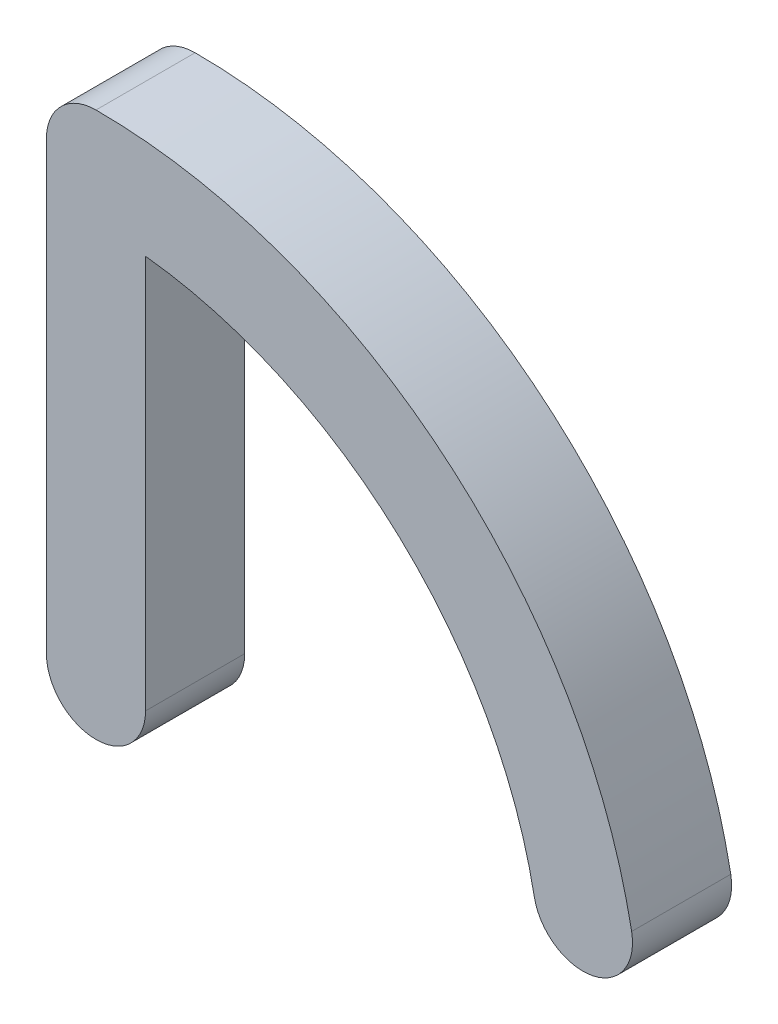
ISO-10303-21;
HEADER;
FILE_DESCRIPTION(('STEP AP214'),'2;1');
FILE_NAME('part.step','',(''),(''),'','','');
FILE_SCHEMA(('AUTOMOTIVE_DESIGN { 1 0 10303 214 1 1 1 1 }'));
ENDSEC;
DATA;
#1=APPLICATION_CONTEXT('core data for automotive mechanical design processes');
#2=APPLICATION_PROTOCOL_DEFINITION('international standard','automotive_design',2000,#1);
#3=PRODUCT_CONTEXT('',#1,'mechanical');
#4=PRODUCT('Part','Part','',(#3));
#5=PRODUCT_RELATED_PRODUCT_CATEGORY('part','',(#4));
#6=PRODUCT_DEFINITION_FORMATION('','',#4);
#7=PRODUCT_DEFINITION_CONTEXT('part definition',#1,'design');
#8=PRODUCT_DEFINITION('design','',#6,#7);
#9=PRODUCT_DEFINITION_SHAPE('','',#8);
#10=(LENGTH_UNIT() NAMED_UNIT(*) SI_UNIT(.MILLI.,.METRE.));
#11=(NAMED_UNIT(*) PLANE_ANGLE_UNIT() SI_UNIT($,.RADIAN.));
#12=(NAMED_UNIT(*) SI_UNIT($,.STERADIAN.) SOLID_ANGLE_UNIT());
#13=UNCERTAINTY_MEASURE_WITH_UNIT(LENGTH_MEASURE(1.E-05),#10,'distance_accuracy_value','');
#14=(GEOMETRIC_REPRESENTATION_CONTEXT(3) GLOBAL_UNCERTAINTY_ASSIGNED_CONTEXT((#13)) GLOBAL_UNIT_ASSIGNED_CONTEXT((#10,
#11,#12)) REPRESENTATION_CONTEXT('',''));
#15=CARTESIAN_POINT('',(0.,0.,0.));
#16=DIRECTION('',(0.,0.,1.));
#17=DIRECTION('',(1.,0.,0.));
#18=AXIS2_PLACEMENT_3D('',#15,#16,#17);
#19=CARTESIAN_POINT('',(0.,0.,10.));
#20=DIRECTION('',(0.,0.,-1.));
#21=DIRECTION('',(-1.,0.,0.));
#22=AXIS2_PLACEMENT_3D('',#19,#20,#21);
#23=CYLINDRICAL_SURFACE('',#22,45.);
#24=CARTESIAN_POINT('',(0.,0.,0.));
#25=DIRECTION('',(0.,0.,1.));
#26=DIRECTION('',(1.,0.,0.));
#27=AXIS2_PLACEMENT_3D('',#24,#25,#26);
#28=CIRCLE('',#27,45.);
#29=CARTESIAN_POINT('',(5.,44.7213595499958,0.));
#30=VERTEX_POINT('',#29);
#31=CARTESIAN_POINT('',(44.2118535857435,8.38522525116545,0.));
#32=VERTEX_POINT('',#31);
#33=EDGE_CURVE('E179',#30,#32,#28,.F.);
#34=ORIENTED_EDGE('',*,*,#33,.T.);
#35=DIRECTION('',(0.,0.,-1.));
#36=VECTOR('',#35,1.);
#37=CARTESIAN_POINT('',(44.2118535857435,8.38522525116545,10.));
#38=LINE('',#37,#36);
#39=CARTESIAN_POINT('',(44.2118535857435,8.38522525116545,10.));
#40=VERTEX_POINT('',#39);
#41=EDGE_CURVE('E248',#32,#40,#38,.F.);
#42=ORIENTED_EDGE('',*,*,#41,.T.);
#43=CARTESIAN_POINT('',(0.,0.,10.));
#44=DIRECTION('',(0.,0.,1.));
#45=DIRECTION('',(1.,0.,0.));
#46=AXIS2_PLACEMENT_3D('',#43,#44,#45);
#47=CIRCLE('',#46,45.);
#48=CARTESIAN_POINT('',(5.,44.7213595499958,10.));
#49=VERTEX_POINT('',#48);
#50=EDGE_CURVE('E185',#49,#40,#47,.F.);
#51=ORIENTED_EDGE('',*,*,#50,.F.);
#52=DIRECTION('',(0.,0.,-1.));
#53=VECTOR('',#52,1.);
#54=CARTESIAN_POINT('',(5.,44.7213595499958,10.));
#55=LINE('',#54,#53);
#56=EDGE_CURVE('E200',#49,#30,#55,.T.);
#57=ORIENTED_EDGE('',*,*,#56,.T.);
#58=EDGE_LOOP('',(#34,#42,#51,#57));
#59=FACE_BOUND('',#58,.T.);
#60=ADVANCED_FACE('F39',(#59),#23,.F.);
#61=CARTESIAN_POINT('',(0.,0.,10.));
#62=DIRECTION('',(0.,0.,-1.));
#63=DIRECTION('',(-1.,0.,0.));
#64=AXIS2_PLACEMENT_3D('',#61,#62,#63);
#65=CYLINDRICAL_SURFACE('',#64,55.);
#66=CARTESIAN_POINT('',(0.,0.,10.));
#67=DIRECTION('',(0.,0.,1.));
#68=DIRECTION('',(1.,0.,0.));
#69=AXIS2_PLACEMENT_3D('',#66,#67,#68);
#70=CIRCLE('',#69,55.);
#71=CARTESIAN_POINT('',(0.,55.,10.));
#72=VERTEX_POINT('',#71);
#73=CARTESIAN_POINT('',(54.0367099381309,10.2486086403133,10.));
#74=VERTEX_POINT('',#73);
#75=EDGE_CURVE('E189',#72,#74,#70,.F.);
#76=ORIENTED_EDGE('',*,*,#75,.T.);
#77=DIRECTION('',(0.,0.,-1.));
#78=VECTOR('',#77,1.);
#79=CARTESIAN_POINT('',(54.0367099381309,10.2486086403133,10.));
#80=LINE('',#79,#78);
#81=CARTESIAN_POINT('',(54.0367099381309,10.2486086403133,0.));
#82=VERTEX_POINT('',#81);
#83=EDGE_CURVE('E230',#74,#82,#80,.T.);
#84=ORIENTED_EDGE('',*,*,#83,.T.);
#85=CARTESIAN_POINT('',(0.,0.,0.));
#86=DIRECTION('',(0.,0.,1.));
#87=DIRECTION('',(1.,0.,0.));
#88=AXIS2_PLACEMENT_3D('',#85,#86,#87);
#89=CIRCLE('',#88,55.);
#90=CARTESIAN_POINT('',(0.,55.,0.));
#91=VERTEX_POINT('',#90);
#92=EDGE_CURVE('E204',#91,#82,#89,.F.);
#93=ORIENTED_EDGE('',*,*,#92,.F.);
#94=DIRECTION('',(0.,0.,-1.));
#95=VECTOR('',#94,1.);
#96=CARTESIAN_POINT('',(0.,55.,10.));
#97=LINE('',#96,#95);
#98=EDGE_CURVE('E223',#91,#72,#97,.F.);
#99=ORIENTED_EDGE('',*,*,#98,.T.);
#100=EDGE_LOOP('',(#76,#84,#93,#99));
#101=FACE_BOUND('',#100,.T.);
#102=ADVANCED_FACE('F306',(#101),#65,.T.);
#103=CARTESIAN_POINT('',(-5.,0.,10.));
#104=DIRECTION('',(-1.,0.,0.));
#105=DIRECTION('',(0.,0.,1.));
#106=AXIS2_PLACEMENT_3D('',#103,#104,#105);
#107=PLANE('',#106);
#108=DIRECTION('',(0.,1.,0.));
#109=VECTOR('',#108,1.);
#110=CARTESIAN_POINT('',(-5.,0.,0.));
#111=LINE('',#110,#109);
#112=CARTESIAN_POINT('',(-5.,5.,0.));
#113=VERTEX_POINT('',#112);
#114=CARTESIAN_POINT('',(-5.,50.,0.));
#115=VERTEX_POINT('',#114);
#116=EDGE_CURVE('E208',#113,#115,#111,.T.);
#117=ORIENTED_EDGE('',*,*,#116,.F.);
#118=DIRECTION('',(0.,0.,-1.));
#119=VECTOR('',#118,1.);
#120=CARTESIAN_POINT('',(-5.,5.,10.));
#121=LINE('',#120,#119);
#122=CARTESIAN_POINT('',(-5.,5.,10.));
#123=VERTEX_POINT('',#122);
#124=EDGE_CURVE('E48',#113,#123,#121,.F.);
#125=ORIENTED_EDGE('',*,*,#124,.T.);
#126=DIRECTION('',(0.,1.,0.));
#127=VECTOR('',#126,1.);
#128=CARTESIAN_POINT('',(-5.,0.,10.));
#129=LINE('',#128,#127);
#130=CARTESIAN_POINT('',(-5.,50.,10.));
#131=VERTEX_POINT('',#130);
#132=EDGE_CURVE('E194',#123,#131,#129,.T.);
#133=ORIENTED_EDGE('',*,*,#132,.T.);
#134=DIRECTION('',(0.,0.,-1.));
#135=VECTOR('',#134,1.);
#136=CARTESIAN_POINT('',(-5.,50.,10.));
#137=LINE('',#136,#135);
#138=EDGE_CURVE('E216',#131,#115,#137,.T.);
#139=ORIENTED_EDGE('',*,*,#138,.T.);
#140=EDGE_LOOP('',(#117,#125,#133,#139));
#141=FACE_BOUND('',#140,.T.);
#142=ADVANCED_FACE('F278',(#141),#107,.T.);
#143=CARTESIAN_POINT('',(5.,0.,10.));
#144=DIRECTION('',(-1.,0.,0.));
#145=DIRECTION('',(0.,0.,1.));
#146=AXIS2_PLACEMENT_3D('',#143,#144,#145);
#147=PLANE('',#146);
#148=DIRECTION('',(0.,1.,0.));
#149=VECTOR('',#148,1.);
#150=CARTESIAN_POINT('',(5.,0.,10.));
#151=LINE('',#150,#149);
#152=CARTESIAN_POINT('',(5.,5.,10.));
#153=VERTEX_POINT('',#152);
#154=EDGE_CURVE('E197',#153,#49,#151,.T.);
#155=ORIENTED_EDGE('',*,*,#154,.F.);
#156=DIRECTION('',(0.,0.,-1.));
#157=VECTOR('',#156,1.);
#158=CARTESIAN_POINT('',(5.,5.,0.));
#159=LINE('',#158,#157);
#160=CARTESIAN_POINT('',(5.,5.,0.));
#161=VERTEX_POINT('',#160);
#162=EDGE_CURVE('E254',#153,#161,#159,.T.);
#163=ORIENTED_EDGE('',*,*,#162,.T.);
#164=DIRECTION('',(0.,1.,0.));
#165=VECTOR('',#164,1.);
#166=CARTESIAN_POINT('',(5.,0.,0.));
#167=LINE('',#166,#165);
#168=EDGE_CURVE('E190',#161,#30,#167,.T.);
#169=ORIENTED_EDGE('',*,*,#168,.T.);
#170=ORIENTED_EDGE('',*,*,#56,.F.);
#171=EDGE_LOOP('',(#155,#163,#169,#170));
#172=FACE_BOUND('',#171,.T.);
#173=ADVANCED_FACE('F289',(#172),#147,.F.);
#174=CARTESIAN_POINT('',(0.,0.,10.));
#175=DIRECTION('',(0.,0.,1.));
#176=DIRECTION('',(1.,0.,0.));
#177=AXIS2_PLACEMENT_3D('',#174,#175,#176);
#178=PLANE('',#177);
#179=ORIENTED_EDGE('',*,*,#132,.F.);
#180=CARTESIAN_POINT('',(0.,5.,10.));
#181=DIRECTION('',(0.,0.,1.));
#182=DIRECTION('',(1.,0.,0.));
#183=AXIS2_PLACEMENT_3D('',#180,#181,#182);
#184=CIRCLE('',#183,5.);
#185=CARTESIAN_POINT('',(0.,0.,10.));
#186=VERTEX_POINT('',#185);
#187=EDGE_CURVE('E11',#123,#186,#184,.T.);
#188=ORIENTED_EDGE('',*,*,#187,.T.);
#189=CARTESIAN_POINT('',(0.,5.,10.));
#190=DIRECTION('',(0.,0.,1.));
#191=DIRECTION('',(1.,0.,0.));
#192=AXIS2_PLACEMENT_3D('',#189,#190,#191);
#193=CIRCLE('',#192,5.);
#194=EDGE_CURVE('E266',#186,#153,#193,.T.);
#195=ORIENTED_EDGE('',*,*,#194,.T.);
#196=ORIENTED_EDGE('',*,*,#154,.T.);
#197=ORIENTED_EDGE('',*,*,#50,.T.);
#198=CARTESIAN_POINT('',(49.1242817619372,9.31691694573939,10.));
#199=DIRECTION('',(0.,0.,1.));
#200=DIRECTION('',(1.,0.,0.));
#201=AXIS2_PLACEMENT_3D('',#198,#199,#200);
#202=CIRCLE('',#201,5.);
#203=CARTESIAN_POINT('',(49.5600604756755,4.33594345528066,10.));
#204=VERTEX_POINT('',#203);
#205=EDGE_CURVE('E251',#40,#204,#202,.T.);
#206=ORIENTED_EDGE('',*,*,#205,.T.);
#207=CARTESIAN_POINT('',(49.1242817619372,9.31691694573939,10.));
#208=DIRECTION('',(0.,0.,1.));
#209=DIRECTION('',(1.,0.,0.));
#210=AXIS2_PLACEMENT_3D('',#207,#208,#209);
#211=CIRCLE('',#210,5.);
#212=EDGE_CURVE('E242',#204,#74,#211,.T.);
#213=ORIENTED_EDGE('',*,*,#212,.T.);
#214=ORIENTED_EDGE('',*,*,#75,.F.);
#215=CARTESIAN_POINT('',(0.,50.,10.));
#216=DIRECTION('',(0.,0.,1.));
#217=DIRECTION('',(1.,0.,0.));
#218=AXIS2_PLACEMENT_3D('',#215,#216,#217);
#219=CIRCLE('',#218,5.);
#220=EDGE_CURVE('E226',#72,#131,#219,.T.);
#221=ORIENTED_EDGE('',*,*,#220,.T.);
#222=EDGE_LOOP('',(#179,#188,#195,#196,#197,#206,#213,#214,#221));
#223=FACE_BOUND('',#222,.T.);
#224=ADVANCED_FACE('F283',(#223),#178,.T.);
#225=CARTESIAN_POINT('',(0.,0.,0.));
#226=DIRECTION('',(0.,0.,1.));
#227=DIRECTION('',(1.,0.,0.));
#228=AXIS2_PLACEMENT_3D('',#225,#226,#227);
#229=PLANE('',#228);
#230=DIRECTION('',(0.0813851986860154,-0.996682722552587,0.));
#231=VECTOR('',#230,1.);
#232=CARTESIAN_POINT('',(2.92099999999999,7.13741415032276,0.));
#233=LINE('',#232,#231);
#234=CARTESIAN_POINT('',(1.92399632761551,19.3472059875435,0.));
#235=VERTEX_POINT('',#234);
#236=CARTESIAN_POINT('',(2.92099999999999,7.13741415032276,0.));
#237=VERTEX_POINT('',#236);
#238=EDGE_CURVE('E170',#235,#237,#233,.T.);
#239=ORIENTED_EDGE('',*,*,#238,.F.);
#240=CARTESIAN_POINT('',(0.,19.1901,0.));
#241=DIRECTION('',(0.,0.,-1.));
#242=DIRECTION('',(-1.,0.,0.));
#243=AXIS2_PLACEMENT_3D('',#240,#241,#242);
#244=CIRCLE('',#243,1.9304);
#245=CARTESIAN_POINT('',(-1.92399632761552,19.3472059875435,0.));
#246=VERTEX_POINT('',#245);
#247=EDGE_CURVE('E55',#246,#235,#244,.T.);
#248=ORIENTED_EDGE('',*,*,#247,.F.);
#249=DIRECTION('',(0.0813851986860155,0.996682722552587,0.));
#250=VECTOR('',#249,1.);
#251=CARTESIAN_POINT('',(-1.92399632761552,19.3472059875435,0.));
#252=LINE('',#251,#250);
#253=CARTESIAN_POINT('',(-2.92100000000001,7.13741415032276,0.));
#254=VERTEX_POINT('',#253);
#255=EDGE_CURVE('E157',#254,#246,#252,.T.);
#256=ORIENTED_EDGE('',*,*,#255,.F.);
#257=CARTESIAN_POINT('',(0.,5.,0.));
#258=DIRECTION('',(0.,0.,-1.));
#259=DIRECTION('',(-1.,0.,0.));
#260=AXIS2_PLACEMENT_3D('',#257,#258,#259);
#261=CIRCLE('',#260,3.6195);
#262=EDGE_CURVE('E161',#237,#254,#261,.T.);
#263=ORIENTED_EDGE('',*,*,#262,.F.);
#264=EDGE_LOOP('',(#239,#248,#256,#263));
#265=FACE_BOUND('',#264,.T.);
#266=CARTESIAN_POINT('',(0.,5.,0.));
#267=DIRECTION('',(0.,0.,1.));
#268=DIRECTION('',(1.,0.,0.));
#269=AXIS2_PLACEMENT_3D('',#266,#267,#268);
#270=CIRCLE('',#269,5.);
#271=CARTESIAN_POINT('',(0.,0.,0.));
#272=VERTEX_POINT('',#271);
#273=EDGE_CURVE('E258',#161,#272,#270,.F.);
#274=ORIENTED_EDGE('',*,*,#273,.T.);
#275=CARTESIAN_POINT('',(0.,5.,0.));
#276=DIRECTION('',(0.,0.,1.));
#277=DIRECTION('',(1.,0.,0.));
#278=AXIS2_PLACEMENT_3D('',#275,#276,#277);
#279=CIRCLE('',#278,5.);
#280=EDGE_CURVE('E269',#272,#113,#279,.F.);
#281=ORIENTED_EDGE('',*,*,#280,.T.);
#282=ORIENTED_EDGE('',*,*,#116,.T.);
#283=CARTESIAN_POINT('',(0.,50.,0.));
#284=DIRECTION('',(0.,0.,1.));
#285=DIRECTION('',(1.,0.,0.));
#286=AXIS2_PLACEMENT_3D('',#283,#284,#285);
#287=CIRCLE('',#286,5.);
#288=EDGE_CURVE('E220',#115,#91,#287,.F.);
#289=ORIENTED_EDGE('',*,*,#288,.T.);
#290=ORIENTED_EDGE('',*,*,#92,.T.);
#291=CARTESIAN_POINT('',(49.1242817619372,9.31691694573939,0.));
#292=DIRECTION('',(0.,0.,1.));
#293=DIRECTION('',(1.,0.,0.));
#294=AXIS2_PLACEMENT_3D('',#291,#292,#293);
#295=CIRCLE('',#294,5.);
#296=CARTESIAN_POINT('',(49.5600604756755,4.33594345528066,0.));
#297=VERTEX_POINT('',#296);
#298=EDGE_CURVE('E234',#82,#297,#295,.F.);
#299=ORIENTED_EDGE('',*,*,#298,.T.);
#300=CARTESIAN_POINT('',(49.1242817619372,9.31691694573939,0.));
#301=DIRECTION('',(0.,0.,1.));
#302=DIRECTION('',(1.,0.,0.));
#303=AXIS2_PLACEMENT_3D('',#300,#301,#302);
#304=CIRCLE('',#303,5.);
#305=EDGE_CURVE('E245',#297,#32,#304,.F.);
#306=ORIENTED_EDGE('',*,*,#305,.T.);
#307=ORIENTED_EDGE('',*,*,#33,.F.);
#308=ORIENTED_EDGE('',*,*,#168,.F.);
#309=EDGE_LOOP('',(#274,#281,#282,#289,#290,#299,#306,#307,#308));
#310=FACE_BOUND('',#309,.T.);
#311=ADVANCED_FACE('F273',(#265,#310),#229,.F.);
#312=CARTESIAN_POINT('',(0.,50.,10.));
#313=DIRECTION('',(0.,0.,-1.));
#314=DIRECTION('',(-1.,0.,0.));
#315=AXIS2_PLACEMENT_3D('',#312,#313,#314);
#316=CYLINDRICAL_SURFACE('',#315,5.);
#317=ORIENTED_EDGE('',*,*,#220,.F.);
#318=ORIENTED_EDGE('',*,*,#98,.F.);
#319=ORIENTED_EDGE('',*,*,#288,.F.);
#320=ORIENTED_EDGE('',*,*,#138,.F.);
#321=EDGE_LOOP('',(#317,#318,#319,#320));
#322=FACE_BOUND('',#321,.T.);
#323=ADVANCED_FACE('F310',(#322),#316,.T.);
#324=CARTESIAN_POINT('',(49.1242817619372,9.31691694573939,10.));
#325=DIRECTION('',(0.,0.,-1.));
#326=DIRECTION('',(-1.,0.,0.));
#327=AXIS2_PLACEMENT_3D('',#324,#325,#326);
#328=CYLINDRICAL_SURFACE('',#327,5.);
#329=ORIENTED_EDGE('',*,*,#212,.F.);
#330=DIRECTION('',(0.,0.,-1.));
#331=VECTOR('',#330,1.);
#332=CARTESIAN_POINT('',(49.5600604756755,4.33594345528066,10.));
#333=LINE('',#332,#331);
#334=EDGE_CURVE('E238',#297,#204,#333,.F.);
#335=ORIENTED_EDGE('',*,*,#334,.F.);
#336=ORIENTED_EDGE('',*,*,#298,.F.);
#337=ORIENTED_EDGE('',*,*,#83,.F.);
#338=EDGE_LOOP('',(#329,#335,#336,#337));
#339=FACE_BOUND('',#338,.T.);
#340=ADVANCED_FACE('F303',(#339),#328,.T.);
#341=CARTESIAN_POINT('',(49.1242817619372,9.31691694573939,10.));
#342=DIRECTION('',(0.,0.,-1.));
#343=DIRECTION('',(-1.,0.,0.));
#344=AXIS2_PLACEMENT_3D('',#341,#342,#343);
#345=CYLINDRICAL_SURFACE('',#344,5.);
#346=ORIENTED_EDGE('',*,*,#205,.F.);
#347=ORIENTED_EDGE('',*,*,#41,.F.);
#348=ORIENTED_EDGE('',*,*,#305,.F.);
#349=ORIENTED_EDGE('',*,*,#334,.T.);
#350=EDGE_LOOP('',(#346,#347,#348,#349));
#351=FACE_BOUND('',#350,.T.);
#352=ADVANCED_FACE('F297',(#351),#345,.T.);
#353=CARTESIAN_POINT('',(0.,5.,10.));
#354=DIRECTION('',(0.,0.,1.));
#355=DIRECTION('',(1.,0.,0.));
#356=AXIS2_PLACEMENT_3D('',#353,#354,#355);
#357=CYLINDRICAL_SURFACE('',#356,5.);
#358=ORIENTED_EDGE('',*,*,#194,.F.);
#359=DIRECTION('',(0.,0.,-1.));
#360=VECTOR('',#359,1.);
#361=CARTESIAN_POINT('',(0.,0.,10.));
#362=LINE('',#361,#360);
#363=EDGE_CURVE('E262',#272,#186,#362,.F.);
#364=ORIENTED_EDGE('',*,*,#363,.F.);
#365=ORIENTED_EDGE('',*,*,#273,.F.);
#366=ORIENTED_EDGE('',*,*,#162,.F.);
#367=EDGE_LOOP('',(#358,#364,#365,#366));
#368=FACE_BOUND('',#367,.T.);
#369=ADVANCED_FACE('F287',(#368),#357,.T.);
#370=CARTESIAN_POINT('',(0.,5.,10.));
#371=DIRECTION('',(0.,0.,-1.));
#372=DIRECTION('',(-1.,0.,0.));
#373=AXIS2_PLACEMENT_3D('',#370,#371,#372);
#374=CYLINDRICAL_SURFACE('',#373,5.);
#375=ORIENTED_EDGE('',*,*,#187,.F.);
#376=ORIENTED_EDGE('',*,*,#124,.F.);
#377=ORIENTED_EDGE('',*,*,#280,.F.);
#378=ORIENTED_EDGE('',*,*,#363,.T.);
#379=EDGE_LOOP('',(#375,#376,#377,#378));
#380=FACE_BOUND('',#379,.T.);
#381=ADVANCED_FACE('F41',(#380),#374,.T.);
#382=CARTESIAN_POINT('',(0.,19.1901,4.5));
#383=DIRECTION('',(0.,0.,-1.));
#384=DIRECTION('',(-1.,0.,0.));
#385=AXIS2_PLACEMENT_3D('',#382,#383,#384);
#386=CYLINDRICAL_SURFACE('',#385,1.9304);
#387=ORIENTED_EDGE('',*,*,#247,.T.);
#388=DIRECTION('',(0.,0.,-1.));
#389=VECTOR('',#388,1.);
#390=CARTESIAN_POINT('',(1.92399632761551,19.3472059875435,4.5));
#391=LINE('',#390,#389);
#392=CARTESIAN_POINT('',(1.92399632761551,19.3472059875435,4.5));
#393=VERTEX_POINT('',#392);
#394=EDGE_CURVE('E132',#393,#235,#391,.T.);
#395=ORIENTED_EDGE('',*,*,#394,.F.);
#396=CARTESIAN_POINT('',(0.,19.1901,4.5));
#397=DIRECTION('',(0.,0.,-1.));
#398=DIRECTION('',(-1.,0.,0.));
#399=AXIS2_PLACEMENT_3D('',#396,#397,#398);
#400=CIRCLE('',#399,1.9304);
#401=CARTESIAN_POINT('',(-1.92399632761552,19.3472059875435,4.5));
#402=VERTEX_POINT('',#401);
#403=EDGE_CURVE('E136',#402,#393,#400,.T.);
#404=ORIENTED_EDGE('',*,*,#403,.F.);
#405=DIRECTION('',(0.,0.,-1.));
#406=VECTOR('',#405,1.);
#407=CARTESIAN_POINT('',(-1.92399632761552,19.3472059875435,4.5));
#408=LINE('',#407,#406);
#409=EDGE_CURVE('E176',#402,#246,#408,.T.);
#410=ORIENTED_EDGE('',*,*,#409,.T.);
#411=EDGE_LOOP('',(#387,#395,#404,#410));
#412=FACE_BOUND('',#411,.T.);
#413=ADVANCED_FACE('F134',(#412),#386,.F.);
#414=CARTESIAN_POINT('',(-1.92399632761552,19.3472059875435,4.5));
#415=DIRECTION('',(-0.996682722552587,0.0813851986860155,0.));
#416=DIRECTION('',(-0.0813851986860155,-0.996682722552587,0.));
#417=AXIS2_PLACEMENT_3D('',#414,#415,#416);
#418=PLANE('',#417);
#419=ORIENTED_EDGE('',*,*,#255,.T.);
#420=ORIENTED_EDGE('',*,*,#409,.F.);
#421=DIRECTION('',(0.0813851986860155,0.996682722552587,0.));
#422=VECTOR('',#421,1.);
#423=CARTESIAN_POINT('',(-1.92399632761552,19.3472059875435,4.5));
#424=LINE('',#423,#422);
#425=CARTESIAN_POINT('',(-2.92100000000001,7.13741415032276,4.5));
#426=VERTEX_POINT('',#425);
#427=EDGE_CURVE('E143',#426,#402,#424,.T.);
#428=ORIENTED_EDGE('',*,*,#427,.F.);
#429=DIRECTION('',(0.,0.,-1.));
#430=VECTOR('',#429,1.);
#431=CARTESIAN_POINT('',(-2.92100000000001,7.13741415032276,4.5));
#432=LINE('',#431,#430);
#433=EDGE_CURVE('E180',#426,#254,#432,.T.);
#434=ORIENTED_EDGE('',*,*,#433,.T.);
#435=EDGE_LOOP('',(#419,#420,#428,#434));
#436=FACE_BOUND('',#435,.T.);
#437=ADVANCED_FACE('F335',(#436),#418,.F.);
#438=CARTESIAN_POINT('',(0.,5.,4.5));
#439=DIRECTION('',(0.,0.,-1.));
#440=DIRECTION('',(-1.,0.,0.));
#441=AXIS2_PLACEMENT_3D('',#438,#439,#440);
#442=CYLINDRICAL_SURFACE('',#441,3.6195);
#443=ORIENTED_EDGE('',*,*,#262,.T.);
#444=ORIENTED_EDGE('',*,*,#433,.F.);
#445=CARTESIAN_POINT('',(0.,5.,4.5));
#446=DIRECTION('',(0.,0.,-1.));
#447=DIRECTION('',(-1.,0.,0.));
#448=AXIS2_PLACEMENT_3D('',#445,#446,#447);
#449=CIRCLE('',#448,3.6195);
#450=CARTESIAN_POINT('',(2.92099999999999,7.13741415032276,4.5));
#451=VERTEX_POINT('',#450);
#452=EDGE_CURVE('E152',#451,#426,#449,.T.);
#453=ORIENTED_EDGE('',*,*,#452,.F.);
#454=DIRECTION('',(0.,0.,-1.));
#455=VECTOR('',#454,1.);
#456=CARTESIAN_POINT('',(2.92099999999999,7.13741415032276,4.5));
#457=LINE('',#456,#455);
#458=EDGE_CURVE('E142',#451,#237,#457,.T.);
#459=ORIENTED_EDGE('',*,*,#458,.T.);
#460=EDGE_LOOP('',(#443,#444,#453,#459));
#461=FACE_BOUND('',#460,.T.);
#462=ADVANCED_FACE('F338',(#461),#442,.F.);
#463=CARTESIAN_POINT('',(2.92099999999999,7.13741415032276,4.5));
#464=DIRECTION('',(0.996682722552587,0.0813851986860154,0.));
#465=DIRECTION('',(-0.0813851986860154,0.996682722552587,0.));
#466=AXIS2_PLACEMENT_3D('',#463,#464,#465);
#467=PLANE('',#466);
#468=ORIENTED_EDGE('',*,*,#238,.T.);
#469=ORIENTED_EDGE('',*,*,#458,.F.);
#470=DIRECTION('',(0.0813851986860154,-0.996682722552587,0.));
#471=VECTOR('',#470,1.);
#472=CARTESIAN_POINT('',(2.92099999999999,7.13741415032276,4.5));
#473=LINE('',#472,#471);
#474=EDGE_CURVE('E146',#393,#451,#473,.T.);
#475=ORIENTED_EDGE('',*,*,#474,.F.);
#476=ORIENTED_EDGE('',*,*,#394,.T.);
#477=EDGE_LOOP('',(#468,#469,#475,#476));
#478=FACE_BOUND('',#477,.T.);
#479=ADVANCED_FACE('F147',(#478),#467,.F.);
#480=CARTESIAN_POINT('',(0.,19.1901,4.5));
#481=DIRECTION('',(0.,0.,-1.));
#482=DIRECTION('',(-1.,0.,0.));
#483=AXIS2_PLACEMENT_3D('',#480,#481,#482);
#484=PLANE('',#483);
#485=ORIENTED_EDGE('',*,*,#403,.T.);
#486=ORIENTED_EDGE('',*,*,#474,.T.);
#487=ORIENTED_EDGE('',*,*,#452,.T.);
#488=ORIENTED_EDGE('',*,*,#427,.T.);
#489=EDGE_LOOP('',(#485,#486,#487,#488));
#490=FACE_BOUND('',#489,.T.);
#491=ADVANCED_FACE('F154',(#490),#484,.T.);
#492=CLOSED_SHELL('',(#60,#102,#142,#173,#224,#311,#323,#340,#352,#369,#381,#413,#437,#462,#479,#491));
#493=MANIFOLD_SOLID_BREP('B2',#492);
#494=ADVANCED_BREP_SHAPE_REPRESENTATION('',(#18,#493),#14);
#495=SHAPE_DEFINITION_REPRESENTATION(#9,#494);
ENDSEC;
END-ISO-10303-21;
